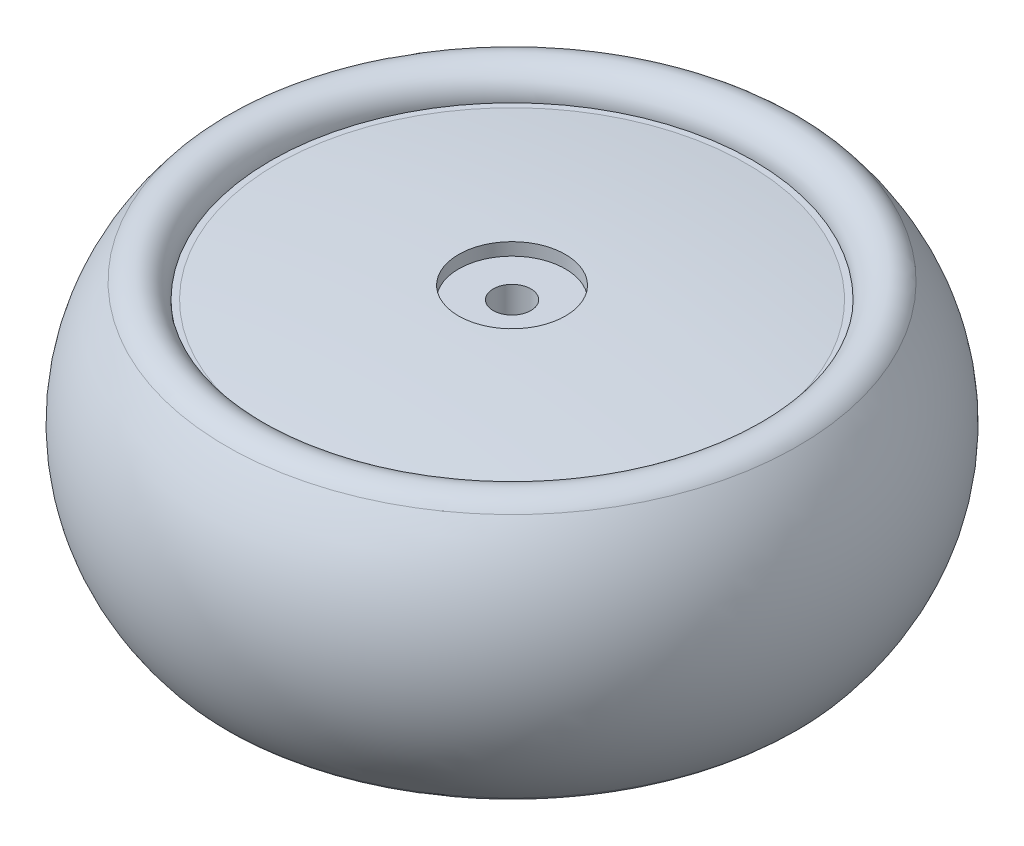
ISO-10303-21;
HEADER;
FILE_DESCRIPTION(('STEP AP214'),'2;1');
FILE_NAME('part.step','',(''),(''),'','','');
FILE_SCHEMA(('AUTOMOTIVE_DESIGN { 1 0 10303 214 1 1 1 1 }'));
ENDSEC;
DATA;
#1=APPLICATION_CONTEXT('core data for automotive mechanical design processes');
#2=APPLICATION_PROTOCOL_DEFINITION('international standard','automotive_design',2000,#1);
#3=PRODUCT_CONTEXT('',#1,'mechanical');
#4=PRODUCT('Part','Part','',(#3));
#5=PRODUCT_RELATED_PRODUCT_CATEGORY('part','',(#4));
#6=PRODUCT_DEFINITION_FORMATION('','',#4);
#7=PRODUCT_DEFINITION_CONTEXT('part definition',#1,'design');
#8=PRODUCT_DEFINITION('design','',#6,#7);
#9=PRODUCT_DEFINITION_SHAPE('','',#8);
#10=(LENGTH_UNIT() NAMED_UNIT(*) SI_UNIT(.MILLI.,.METRE.));
#11=(NAMED_UNIT(*) PLANE_ANGLE_UNIT() SI_UNIT($,.RADIAN.));
#12=(NAMED_UNIT(*) SI_UNIT($,.STERADIAN.) SOLID_ANGLE_UNIT());
#13=UNCERTAINTY_MEASURE_WITH_UNIT(LENGTH_MEASURE(1.E-05),#10,'distance_accuracy_value','');
#14=(GEOMETRIC_REPRESENTATION_CONTEXT(3) GLOBAL_UNCERTAINTY_ASSIGNED_CONTEXT((#13)) GLOBAL_UNIT_ASSIGNED_CONTEXT((#10,
#11,#12)) REPRESENTATION_CONTEXT('',''));
#15=CARTESIAN_POINT('',(0.,0.,0.));
#16=DIRECTION('',(0.,0.,1.));
#17=DIRECTION('',(1.,0.,0.));
#18=AXIS2_PLACEMENT_3D('',#15,#16,#17);
#19=CARTESIAN_POINT('',(0.,26.9875,-2.38125000000001));
#20=DIRECTION('',(0.,-1.,0.));
#21=DIRECTION('',(0.,0.,-1.));
#22=AXIS2_PLACEMENT_3D('',#19,#20,#21);
#23=PLANE('',#22);
#24=CARTESIAN_POINT('',(0.,26.9875,0.));
#25=DIRECTION('',(0.,1.,0.));
#26=DIRECTION('',(0.,0.,1.));
#27=AXIS2_PLACEMENT_3D('',#24,#25,#26);
#28=CIRCLE('',#27,2.38125);
#29=CARTESIAN_POINT('',(0.,26.9875,2.38124999999999));
#30=VERTEX_POINT('',#29);
#31=EDGE_CURVE('E63',#30,#30,#28,.T.);
#32=ORIENTED_EDGE('',*,*,#31,.F.);
#33=EDGE_LOOP('',(#32));
#34=FACE_BOUND('',#33,.T.);
#35=CARTESIAN_POINT('',(0.,26.9875,0.));
#36=DIRECTION('',(0.,1.,0.));
#37=DIRECTION('',(0.,0.,1.));
#38=AXIS2_PLACEMENT_3D('',#35,#36,#37);
#39=CIRCLE('',#38,6.746875);
#40=CARTESIAN_POINT('',(0.,26.9875,6.74687499999999));
#41=VERTEX_POINT('',#40);
#42=EDGE_CURVE('E10',#41,#41,#39,.T.);
#43=ORIENTED_EDGE('',*,*,#42,.T.);
#44=EDGE_LOOP('',(#43));
#45=FACE_BOUND('',#44,.T.);
#46=ADVANCED_FACE('F35',(#34,#45),#23,.F.);
#47=CARTESIAN_POINT('',(0.,88.3568887386738,0.));
#48=DIRECTION('',(0.,1.,0.));
#49=DIRECTION('',(0.,0.,1.));
#50=AXIS2_PLACEMENT_3D('',#47,#48,#49);
#51=CYLINDRICAL_SURFACE('',#50,6.74687499999999);
#52=ORIENTED_EDGE('',*,*,#42,.F.);
#53=EDGE_LOOP('',(#52));
#54=FACE_BOUND('',#53,.T.);
#55=CARTESIAN_POINT('',(0.,28.575,0.));
#56=DIRECTION('',(0.,1.,0.));
#57=DIRECTION('',(0.,0.,1.));
#58=AXIS2_PLACEMENT_3D('',#55,#56,#57);
#59=CIRCLE('',#58,6.74687499999998);
#60=CARTESIAN_POINT('',(0.,28.575,6.74687499999997));
#61=VERTEX_POINT('',#60);
#62=EDGE_CURVE('E41',#61,#61,#59,.T.);
#63=ORIENTED_EDGE('',*,*,#62,.T.);
#64=EDGE_LOOP('',(#63));
#65=FACE_BOUND('',#64,.T.);
#66=ADVANCED_FACE('F91',(#54,#65),#51,.F.);
#67=CARTESIAN_POINT('',(0.,-221.654692838707,0.));
#68=DIRECTION('',(0.,1.,0.));
#69=DIRECTION('',(0.,0.,1.));
#70=AXIS2_PLACEMENT_3D('',#67,#68,#69);
#71=DEGENERATE_TOROIDAL_SURFACE('',#70,0.994293558140541,250.295807738361,.T.);
#72=ORIENTED_EDGE('',*,*,#62,.F.);
#73=EDGE_LOOP('',(#72));
#74=FACE_BOUND('',#73,.T.);
#75=CARTESIAN_POINT('',(0.,26.9875,0.));
#76=DIRECTION('',(0.,1.,0.));
#77=DIRECTION('',(0.,0.,1.));
#78=AXIS2_PLACEMENT_3D('',#75,#76,#77);
#79=CIRCLE('',#78,29.718);
#80=CARTESIAN_POINT('',(0.,26.9875,29.718));
#81=VERTEX_POINT('',#80);
#82=EDGE_CURVE('E45',#81,#81,#79,.T.);
#83=ORIENTED_EDGE('',*,*,#82,.T.);
#84=EDGE_LOOP('',(#83));
#85=FACE_BOUND('',#84,.T.);
#86=ADVANCED_FACE('F81',(#74,#85),#71,.T.);
#87=CARTESIAN_POINT('',(0.,26.9875,-30.48));
#88=DIRECTION('',(0.,-1.,0.));
#89=DIRECTION('',(0.,0.,-1.));
#90=AXIS2_PLACEMENT_3D('',#87,#88,#89);
#91=PLANE('',#90);
#92=ORIENTED_EDGE('',*,*,#82,.F.);
#93=EDGE_LOOP('',(#92));
#94=FACE_BOUND('',#93,.T.);
#95=CARTESIAN_POINT('',(0.,26.9875,0.));
#96=DIRECTION('',(0.,-1.,0.));
#97=DIRECTION('',(0.,0.,-1.));
#98=AXIS2_PLACEMENT_3D('',#95,#96,#97);
#99=CIRCLE('',#98,30.48);
#100=CARTESIAN_POINT('',(0.,26.9875,-30.48));
#101=VERTEX_POINT('',#100);
#102=EDGE_CURVE('E72',#101,#101,#99,.T.);
#103=ORIENTED_EDGE('',*,*,#102,.F.);
#104=EDGE_LOOP('',(#103));
#105=FACE_BOUND('',#104,.T.);
#106=ADVANCED_FACE('F78',(#94,#105),#91,.F.);
#107=CARTESIAN_POINT('',(0.,0.,-26.67));
#108=DIRECTION('',(0.,1.,0.));
#109=DIRECTION('',(0.,0.,1.));
#110=AXIS2_PLACEMENT_3D('',#107,#108,#109);
#111=PLANE('',#110);
#112=CARTESIAN_POINT('',(0.,0.,0.));
#113=DIRECTION('',(0.,1.,0.));
#114=DIRECTION('',(0.,0.,1.));
#115=AXIS2_PLACEMENT_3D('',#112,#113,#114);
#116=CIRCLE('',#115,30.48);
#117=CARTESIAN_POINT('',(0.,0.,30.48));
#118=VERTEX_POINT('',#117);
#119=EDGE_CURVE('E49',#118,#118,#116,.T.);
#120=ORIENTED_EDGE('',*,*,#119,.F.);
#121=EDGE_LOOP('',(#120));
#122=FACE_BOUND('',#121,.T.);
#123=CARTESIAN_POINT('',(0.,0.,0.));
#124=DIRECTION('',(0.,1.,0.));
#125=DIRECTION('',(0.,0.,1.));
#126=AXIS2_PLACEMENT_3D('',#123,#124,#125);
#127=CIRCLE('',#126,26.67);
#128=CARTESIAN_POINT('',(0.,0.,26.67));
#129=VERTEX_POINT('',#128);
#130=EDGE_CURVE('E54',#129,#129,#127,.T.);
#131=ORIENTED_EDGE('',*,*,#130,.T.);
#132=EDGE_LOOP('',(#131));
#133=FACE_BOUND('',#132,.T.);
#134=ADVANCED_FACE('F80',(#122,#133),#111,.F.);
#135=CARTESIAN_POINT('',(0.,88.3568887386738,0.));
#136=DIRECTION('',(0.,1.,0.));
#137=DIRECTION('',(0.,0.,1.));
#138=AXIS2_PLACEMENT_3D('',#135,#136,#137);
#139=CYLINDRICAL_SURFACE('',#138,26.67);
#140=ORIENTED_EDGE('',*,*,#130,.F.);
#141=EDGE_LOOP('',(#140));
#142=FACE_BOUND('',#141,.T.);
#143=CARTESIAN_POINT('',(0.,22.225,0.));
#144=DIRECTION('',(0.,1.,0.));
#145=DIRECTION('',(0.,0.,1.));
#146=AXIS2_PLACEMENT_3D('',#143,#144,#145);
#147=CIRCLE('',#146,26.67);
#148=CARTESIAN_POINT('',(0.,22.225,26.67));
#149=VERTEX_POINT('',#148);
#150=EDGE_CURVE('E57',#149,#149,#147,.T.);
#151=ORIENTED_EDGE('',*,*,#150,.T.);
#152=EDGE_LOOP('',(#151));
#153=FACE_BOUND('',#152,.T.);
#154=ADVANCED_FACE('F88',(#142,#153),#139,.F.);
#155=CARTESIAN_POINT('',(0.,22.225,-2.38125000000001));
#156=DIRECTION('',(0.,1.,0.));
#157=DIRECTION('',(0.,0.,1.));
#158=AXIS2_PLACEMENT_3D('',#155,#156,#157);
#159=PLANE('',#158);
#160=ORIENTED_EDGE('',*,*,#150,.F.);
#161=EDGE_LOOP('',(#160));
#162=FACE_BOUND('',#161,.T.);
#163=CARTESIAN_POINT('',(0.,22.225,0.));
#164=DIRECTION('',(0.,1.,0.));
#165=DIRECTION('',(0.,0.,1.));
#166=AXIS2_PLACEMENT_3D('',#163,#164,#165);
#167=CIRCLE('',#166,2.38125);
#168=CARTESIAN_POINT('',(0.,22.225,2.38124999999999));
#169=VERTEX_POINT('',#168);
#170=EDGE_CURVE('E60',#169,#169,#167,.T.);
#171=ORIENTED_EDGE('',*,*,#170,.T.);
#172=EDGE_LOOP('',(#171));
#173=FACE_BOUND('',#172,.T.);
#174=ADVANCED_FACE('F105',(#162,#173),#159,.F.);
#175=CARTESIAN_POINT('',(0.,88.3568887386738,0.));
#176=DIRECTION('',(0.,1.,0.));
#177=DIRECTION('',(0.,0.,1.));
#178=AXIS2_PLACEMENT_3D('',#175,#176,#177);
#179=CYLINDRICAL_SURFACE('',#178,2.38125);
#180=ORIENTED_EDGE('',*,*,#170,.F.);
#181=EDGE_LOOP('',(#180));
#182=FACE_BOUND('',#181,.T.);
#183=ORIENTED_EDGE('',*,*,#31,.T.);
#184=EDGE_LOOP('',(#183));
#185=FACE_BOUND('',#184,.T.);
#186=ADVANCED_FACE('F103',(#182,#185),#179,.F.);
#187=CARTESIAN_POINT('',(0.,26.9875,0.));
#188=DIRECTION('',(0.,-1.,0.));
#189=DIRECTION('',(0.,0.,-1.));
#190=AXIS2_PLACEMENT_3D('',#187,#188,#189);
#191=TOROIDAL_SURFACE('',#190,33.655,3.175);
#192=CARTESIAN_POINT('',(0.,29.0010081407163,0.));
#193=DIRECTION('',(0.,-1.,0.));
#194=DIRECTION('',(0.,0.,-1.));
#195=AXIS2_PLACEMENT_3D('',#192,#193,#194);
#196=CIRCLE('',#195,36.1098747355556);
#197=CARTESIAN_POINT('',(0.,29.0010081407163,-36.1098747355556));
#198=VERTEX_POINT('',#197);
#199=EDGE_CURVE('E66',#198,#198,#196,.T.);
#200=ORIENTED_EDGE('',*,*,#199,.F.);
#201=EDGE_LOOP('',(#200));
#202=FACE_BOUND('',#201,.T.);
#203=ORIENTED_EDGE('',*,*,#102,.T.);
#204=EDGE_LOOP('',(#203));
#205=FACE_BOUND('',#204,.T.);
#206=ADVANCED_FACE('F76',(#202,#205),#191,.T.);
#207=CARTESIAN_POINT('',(0.,13.49375,0.));
#208=DIRECTION('',(0.,-1.,0.));
#209=DIRECTION('',(0.,0.,-1.));
#210=AXIS2_PLACEMENT_3D('',#207,#208,#209);
#211=DEGENERATE_TOROIDAL_SURFACE('',#210,17.2033824013158,24.4526175986842,.T.);
#212=CARTESIAN_POINT('',(0.,-2.01350814071634,0.));
#213=DIRECTION('',(0.,-1.,0.));
#214=DIRECTION('',(0.,0.,-1.));
#215=AXIS2_PLACEMENT_3D('',#212,#213,#214);
#216=CIRCLE('',#215,36.1098747355556);
#217=CARTESIAN_POINT('',(0.,-2.01350814071634,-36.1098747355556));
#218=VERTEX_POINT('',#217);
#219=EDGE_CURVE('E69',#218,#218,#216,.T.);
#220=ORIENTED_EDGE('',*,*,#219,.F.);
#221=EDGE_LOOP('',(#220));
#222=FACE_BOUND('',#221,.T.);
#223=ORIENTED_EDGE('',*,*,#199,.T.);
#224=EDGE_LOOP('',(#223));
#225=FACE_BOUND('',#224,.T.);
#226=ADVANCED_FACE('F112',(#222,#225),#211,.T.);
#227=CARTESIAN_POINT('',(0.,0.,0.));
#228=DIRECTION('',(0.,-1.,0.));
#229=DIRECTION('',(0.,0.,-1.));
#230=AXIS2_PLACEMENT_3D('',#227,#228,#229);
#231=TOROIDAL_SURFACE('',#230,33.655,3.175);
#232=ORIENTED_EDGE('',*,*,#119,.T.);
#233=EDGE_LOOP('',(#232));
#234=FACE_BOUND('',#233,.T.);
#235=ORIENTED_EDGE('',*,*,#219,.T.);
#236=EDGE_LOOP('',(#235));
#237=FACE_BOUND('',#236,.T.);
#238=ADVANCED_FACE('F156',(#234,#237),#231,.T.);
#239=CLOSED_SHELL('',(#46,#66,#86,#106,#134,#154,#174,#186,#206,#226,#238));
#240=MANIFOLD_SOLID_BREP('B2',#239);
#241=ADVANCED_BREP_SHAPE_REPRESENTATION('',(#18,#240),#14);
#242=SHAPE_DEFINITION_REPRESENTATION(#9,#241);
ENDSEC;
END-ISO-10303-21;
